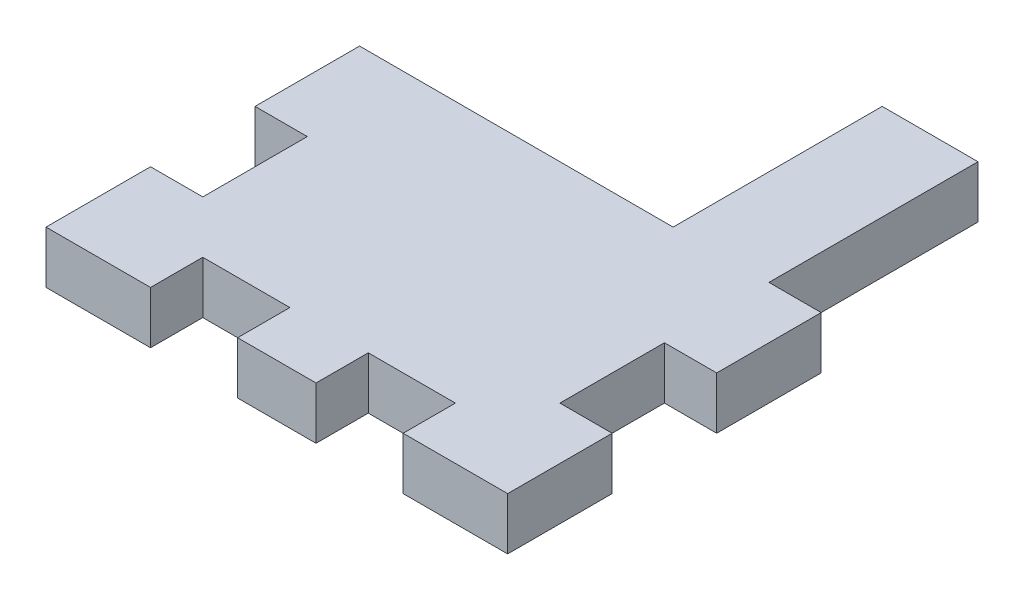
ISO-10303-21;
HEADER;
FILE_DESCRIPTION(('STEP AP214'),'2;1');
FILE_NAME('part.step','',(''),(''),'','','');
FILE_SCHEMA(('AUTOMOTIVE_DESIGN { 1 0 10303 214 1 1 1 1 }'));
ENDSEC;
DATA;
#1=APPLICATION_CONTEXT('core data for automotive mechanical design processes');
#2=APPLICATION_PROTOCOL_DEFINITION('international standard','automotive_design',2000,#1);
#3=PRODUCT_CONTEXT('',#1,'mechanical');
#4=PRODUCT('Part','Part','',(#3));
#5=PRODUCT_RELATED_PRODUCT_CATEGORY('part','',(#4));
#6=PRODUCT_DEFINITION_FORMATION('','',#4);
#7=PRODUCT_DEFINITION_CONTEXT('part definition',#1,'design');
#8=PRODUCT_DEFINITION('design','',#6,#7);
#9=PRODUCT_DEFINITION_SHAPE('','',#8);
#10=(LENGTH_UNIT() NAMED_UNIT(*) SI_UNIT(.MILLI.,.METRE.));
#11=(NAMED_UNIT(*) PLANE_ANGLE_UNIT() SI_UNIT($,.RADIAN.));
#12=(NAMED_UNIT(*) SI_UNIT($,.STERADIAN.) SOLID_ANGLE_UNIT());
#13=UNCERTAINTY_MEASURE_WITH_UNIT(LENGTH_MEASURE(1.E-05),#10,'distance_accuracy_value','');
#14=(GEOMETRIC_REPRESENTATION_CONTEXT(3) GLOBAL_UNCERTAINTY_ASSIGNED_CONTEXT((#13)) GLOBAL_UNIT_ASSIGNED_CONTEXT((#10,
#11,#12)) REPRESENTATION_CONTEXT('',''));
#15=CARTESIAN_POINT('',(0.,0.,0.));
#16=DIRECTION('',(0.,0.,1.));
#17=DIRECTION('',(1.,0.,0.));
#18=AXIS2_PLACEMENT_3D('',#15,#16,#17);
#19=CARTESIAN_POINT('',(-10.391815678133,-10.5737884773684,24.9707008080473));
#20=DIRECTION('',(0.,0.,-1.));
#21=DIRECTION('',(-1.,0.,0.));
#22=AXIS2_PLACEMENT_3D('',#19,#20,#21);
#23=PLANE('',#22);
#24=DIRECTION('',(1.,0.,0.));
#25=VECTOR('',#24,1.);
#26=CARTESIAN_POINT('',(-10.391815678133,-13.5737884773684,24.9707008080473));
#27=LINE('',#26,#25);
#28=CARTESIAN_POINT('',(-16.391815678133,-13.5737884773684,24.9707008080473));
#29=VERTEX_POINT('',#28);
#30=CARTESIAN_POINT('',(-10.391815678133,-13.5737884773684,24.9707008080473));
#31=VERTEX_POINT('',#30);
#32=EDGE_CURVE('E227',#29,#31,#27,.T.);
#33=ORIENTED_EDGE('',*,*,#32,.T.);
#34=DIRECTION('',(0.,-1.,0.));
#35=VECTOR('',#34,1.);
#36=CARTESIAN_POINT('',(-10.391815678133,-10.5737884773684,24.9707008080473));
#37=LINE('',#36,#35);
#38=CARTESIAN_POINT('',(-10.391815678133,-10.5737884773684,24.9707008080473));
#39=VERTEX_POINT('',#38);
#40=EDGE_CURVE('E42',#39,#31,#37,.T.);
#41=ORIENTED_EDGE('',*,*,#40,.F.);
#42=DIRECTION('',(1.,0.,0.));
#43=VECTOR('',#42,1.);
#44=CARTESIAN_POINT('',(-10.391815678133,-10.5737884773684,24.9707008080473));
#45=LINE('',#44,#43);
#46=CARTESIAN_POINT('',(-16.391815678133,-10.5737884773684,24.9707008080473));
#47=VERTEX_POINT('',#46);
#48=EDGE_CURVE('E273',#47,#39,#45,.T.);
#49=ORIENTED_EDGE('',*,*,#48,.F.);
#50=DIRECTION('',(0.,-1.,0.));
#51=VECTOR('',#50,1.);
#52=CARTESIAN_POINT('',(-16.391815678133,-10.5737884773684,24.9707008080473));
#53=LINE('',#52,#51);
#54=EDGE_CURVE('E223',#47,#29,#53,.T.);
#55=ORIENTED_EDGE('',*,*,#54,.T.);
#56=EDGE_LOOP('',(#33,#41,#49,#55));
#57=FACE_BOUND('',#56,.T.);
#58=ADVANCED_FACE('F35',(#57),#23,.F.);
#59=CARTESIAN_POINT('',(-10.391815678133,-10.5737884773684,21.9707008080473));
#60=DIRECTION('',(-1.,0.,0.));
#61=DIRECTION('',(0.,0.,1.));
#62=AXIS2_PLACEMENT_3D('',#59,#60,#61);
#63=PLANE('',#62);
#64=DIRECTION('',(0.,0.,-1.));
#65=VECTOR('',#64,1.);
#66=CARTESIAN_POINT('',(-10.391815678133,-13.5737884773684,21.9707008080473));
#67=LINE('',#66,#65);
#68=CARTESIAN_POINT('',(-10.391815678133,-13.5737884773684,21.9707008080473));
#69=VERTEX_POINT('',#68);
#70=EDGE_CURVE('E230',#31,#69,#67,.T.);
#71=ORIENTED_EDGE('',*,*,#70,.T.);
#72=DIRECTION('',(0.,-1.,0.));
#73=VECTOR('',#72,1.);
#74=CARTESIAN_POINT('',(-10.391815678133,-10.5737884773684,21.9707008080473));
#75=LINE('',#74,#73);
#76=CARTESIAN_POINT('',(-10.391815678133,-10.5737884773684,21.9707008080473));
#77=VERTEX_POINT('',#76);
#78=EDGE_CURVE('E325',#77,#69,#75,.T.);
#79=ORIENTED_EDGE('',*,*,#78,.F.);
#80=DIRECTION('',(0.,0.,-1.));
#81=VECTOR('',#80,1.);
#82=CARTESIAN_POINT('',(-10.391815678133,-10.5737884773684,21.9707008080473));
#83=LINE('',#82,#81);
#84=EDGE_CURVE('E141',#39,#77,#83,.T.);
#85=ORIENTED_EDGE('',*,*,#84,.F.);
#86=ORIENTED_EDGE('',*,*,#40,.T.);
#87=EDGE_LOOP('',(#71,#79,#85,#86));
#88=FACE_BOUND('',#87,.T.);
#89=ADVANCED_FACE('F328',(#88),#63,.F.);
#90=CARTESIAN_POINT('',(-5.39181567813297,-10.5737884773684,21.9707008080473));
#91=DIRECTION('',(0.,0.,-1.));
#92=DIRECTION('',(-1.,0.,0.));
#93=AXIS2_PLACEMENT_3D('',#90,#91,#92);
#94=PLANE('',#93);
#95=DIRECTION('',(1.,0.,0.));
#96=VECTOR('',#95,1.);
#97=CARTESIAN_POINT('',(-5.39181567813297,-13.5737884773684,21.9707008080473));
#98=LINE('',#97,#96);
#99=CARTESIAN_POINT('',(-5.39181567813297,-13.5737884773684,21.9707008080473));
#100=VERTEX_POINT('',#99);
#101=EDGE_CURVE('E233',#69,#100,#98,.T.);
#102=ORIENTED_EDGE('',*,*,#101,.T.);
#103=DIRECTION('',(0.,-1.,0.));
#104=VECTOR('',#103,1.);
#105=CARTESIAN_POINT('',(-5.39181567813297,-10.5737884773684,21.9707008080473));
#106=LINE('',#105,#104);
#107=CARTESIAN_POINT('',(-5.39181567813297,-10.5737884773684,21.9707008080473));
#108=VERTEX_POINT('',#107);
#109=EDGE_CURVE('E322',#108,#100,#106,.T.);
#110=ORIENTED_EDGE('',*,*,#109,.F.);
#111=DIRECTION('',(1.,0.,0.));
#112=VECTOR('',#111,1.);
#113=CARTESIAN_POINT('',(-5.39181567813297,-10.5737884773684,21.9707008080473));
#114=LINE('',#113,#112);
#115=EDGE_CURVE('E347',#77,#108,#114,.T.);
#116=ORIENTED_EDGE('',*,*,#115,.F.);
#117=ORIENTED_EDGE('',*,*,#78,.T.);
#118=EDGE_LOOP('',(#102,#110,#116,#117));
#119=FACE_BOUND('',#118,.T.);
#120=ADVANCED_FACE('F338',(#119),#94,.F.);
#121=CARTESIAN_POINT('',(-5.39181567813297,-10.5737884773684,24.9707008080473));
#122=DIRECTION('',(1.,0.,0.));
#123=DIRECTION('',(0.,0.,-1.));
#124=AXIS2_PLACEMENT_3D('',#121,#122,#123);
#125=PLANE('',#124);
#126=DIRECTION('',(0.,0.,1.));
#127=VECTOR('',#126,1.);
#128=CARTESIAN_POINT('',(-5.39181567813297,-13.5737884773684,24.9707008080473));
#129=LINE('',#128,#127);
#130=CARTESIAN_POINT('',(-5.39181567813297,-13.5737884773684,24.9707008080473));
#131=VERTEX_POINT('',#130);
#132=EDGE_CURVE('E235',#100,#131,#129,.T.);
#133=ORIENTED_EDGE('',*,*,#132,.T.);
#134=DIRECTION('',(0.,-1.,0.));
#135=VECTOR('',#134,1.);
#136=CARTESIAN_POINT('',(-5.39181567813297,-10.5737884773684,24.9707008080473));
#137=LINE('',#136,#135);
#138=CARTESIAN_POINT('',(-5.39181567813297,-10.5737884773684,24.9707008080473));
#139=VERTEX_POINT('',#138);
#140=EDGE_CURVE('E319',#139,#131,#137,.T.);
#141=ORIENTED_EDGE('',*,*,#140,.F.);
#142=DIRECTION('',(0.,0.,1.));
#143=VECTOR('',#142,1.);
#144=CARTESIAN_POINT('',(-5.39181567813297,-10.5737884773684,24.9707008080473));
#145=LINE('',#144,#143);
#146=EDGE_CURVE('E344',#108,#139,#145,.T.);
#147=ORIENTED_EDGE('',*,*,#146,.F.);
#148=ORIENTED_EDGE('',*,*,#109,.T.);
#149=EDGE_LOOP('',(#133,#141,#147,#148));
#150=FACE_BOUND('',#149,.T.);
#151=ADVANCED_FACE('F342',(#150),#125,.F.);
#152=CARTESIAN_POINT('',(-0.891815678132974,-10.5737884773684,24.9707008080473));
#153=DIRECTION('',(0.,0.,-1.));
#154=DIRECTION('',(-1.,0.,0.));
#155=AXIS2_PLACEMENT_3D('',#152,#153,#154);
#156=PLANE('',#155);
#157=DIRECTION('',(1.,0.,0.));
#158=VECTOR('',#157,1.);
#159=CARTESIAN_POINT('',(-0.891815678132974,-13.5737884773684,24.9707008080473));
#160=LINE('',#159,#158);
#161=CARTESIAN_POINT('',(-0.891815678132974,-13.5737884773684,24.9707008080473));
#162=VERTEX_POINT('',#161);
#163=EDGE_CURVE('E237',#131,#162,#160,.T.);
#164=ORIENTED_EDGE('',*,*,#163,.T.);
#165=DIRECTION('',(0.,-1.,0.));
#166=VECTOR('',#165,1.);
#167=CARTESIAN_POINT('',(-0.891815678132974,-10.5737884773684,24.9707008080473));
#168=LINE('',#167,#166);
#169=CARTESIAN_POINT('',(-0.891815678132974,-10.5737884773684,24.9707008080473));
#170=VERTEX_POINT('',#169);
#171=EDGE_CURVE('E316',#170,#162,#168,.T.);
#172=ORIENTED_EDGE('',*,*,#171,.F.);
#173=DIRECTION('',(1.,0.,0.));
#174=VECTOR('',#173,1.);
#175=CARTESIAN_POINT('',(-0.891815678132974,-10.5737884773684,24.9707008080473));
#176=LINE('',#175,#174);
#177=EDGE_CURVE('E346',#139,#170,#176,.T.);
#178=ORIENTED_EDGE('',*,*,#177,.F.);
#179=ORIENTED_EDGE('',*,*,#140,.T.);
#180=EDGE_LOOP('',(#164,#172,#178,#179));
#181=FACE_BOUND('',#180,.T.);
#182=ADVANCED_FACE('F466',(#181),#156,.F.);
#183=CARTESIAN_POINT('',(-0.891815678132974,-10.5737884773684,21.9707008080473));
#184=DIRECTION('',(-1.,0.,0.));
#185=DIRECTION('',(0.,0.,1.));
#186=AXIS2_PLACEMENT_3D('',#183,#184,#185);
#187=PLANE('',#186);
#188=DIRECTION('',(0.,0.,-1.));
#189=VECTOR('',#188,1.);
#190=CARTESIAN_POINT('',(-0.891815678132974,-13.5737884773684,21.9707008080473));
#191=LINE('',#190,#189);
#192=CARTESIAN_POINT('',(-0.891815678132974,-13.5737884773684,21.9707008080473));
#193=VERTEX_POINT('',#192);
#194=EDGE_CURVE('E239',#162,#193,#191,.T.);
#195=ORIENTED_EDGE('',*,*,#194,.T.);
#196=DIRECTION('',(0.,-1.,0.));
#197=VECTOR('',#196,1.);
#198=CARTESIAN_POINT('',(-0.891815678132974,-10.5737884773684,21.9707008080473));
#199=LINE('',#198,#197);
#200=CARTESIAN_POINT('',(-0.891815678132974,-10.5737884773684,21.9707008080473));
#201=VERTEX_POINT('',#200);
#202=EDGE_CURVE('E313',#201,#193,#199,.T.);
#203=ORIENTED_EDGE('',*,*,#202,.F.);
#204=DIRECTION('',(0.,0.,-1.));
#205=VECTOR('',#204,1.);
#206=CARTESIAN_POINT('',(-0.891815678132974,-10.5737884773684,21.9707008080473));
#207=LINE('',#206,#205);
#208=EDGE_CURVE('E349',#170,#201,#207,.T.);
#209=ORIENTED_EDGE('',*,*,#208,.F.);
#210=ORIENTED_EDGE('',*,*,#171,.T.);
#211=EDGE_LOOP('',(#195,#203,#209,#210));
#212=FACE_BOUND('',#211,.T.);
#213=ADVANCED_FACE('F462',(#212),#187,.F.);
#214=CARTESIAN_POINT('',(4.10818432186703,-10.5737884773684,21.9707008080473));
#215=DIRECTION('',(0.,0.,-1.));
#216=DIRECTION('',(-1.,0.,0.));
#217=AXIS2_PLACEMENT_3D('',#214,#215,#216);
#218=PLANE('',#217);
#219=DIRECTION('',(1.,0.,0.));
#220=VECTOR('',#219,1.);
#221=CARTESIAN_POINT('',(4.10818432186703,-13.5737884773684,21.9707008080473));
#222=LINE('',#221,#220);
#223=CARTESIAN_POINT('',(4.10818432186703,-13.5737884773684,21.9707008080473));
#224=VERTEX_POINT('',#223);
#225=EDGE_CURVE('E241',#193,#224,#222,.T.);
#226=ORIENTED_EDGE('',*,*,#225,.T.);
#227=DIRECTION('',(0.,-1.,0.));
#228=VECTOR('',#227,1.);
#229=CARTESIAN_POINT('',(4.10818432186703,-10.5737884773684,21.9707008080473));
#230=LINE('',#229,#228);
#231=CARTESIAN_POINT('',(4.10818432186703,-10.5737884773684,21.9707008080473));
#232=VERTEX_POINT('',#231);
#233=EDGE_CURVE('E310',#232,#224,#230,.T.);
#234=ORIENTED_EDGE('',*,*,#233,.F.);
#235=DIRECTION('',(1.,0.,0.));
#236=VECTOR('',#235,1.);
#237=CARTESIAN_POINT('',(4.10818432186703,-10.5737884773684,21.9707008080473));
#238=LINE('',#237,#236);
#239=EDGE_CURVE('E355',#201,#232,#238,.T.);
#240=ORIENTED_EDGE('',*,*,#239,.F.);
#241=ORIENTED_EDGE('',*,*,#202,.T.);
#242=EDGE_LOOP('',(#226,#234,#240,#241));
#243=FACE_BOUND('',#242,.T.);
#244=ADVANCED_FACE('F458',(#243),#218,.F.);
#245=CARTESIAN_POINT('',(4.10818432186703,-10.5737884773684,24.9707008080473));
#246=DIRECTION('',(1.,0.,0.));
#247=DIRECTION('',(0.,0.,-1.));
#248=AXIS2_PLACEMENT_3D('',#245,#246,#247);
#249=PLANE('',#248);
#250=DIRECTION('',(0.,0.,1.));
#251=VECTOR('',#250,1.);
#252=CARTESIAN_POINT('',(4.10818432186703,-13.5737884773684,24.9707008080473));
#253=LINE('',#252,#251);
#254=CARTESIAN_POINT('',(4.10818432186703,-13.5737884773684,24.9707008080473));
#255=VERTEX_POINT('',#254);
#256=EDGE_CURVE('E243',#224,#255,#253,.T.);
#257=ORIENTED_EDGE('',*,*,#256,.T.);
#258=DIRECTION('',(0.,-1.,0.));
#259=VECTOR('',#258,1.);
#260=CARTESIAN_POINT('',(4.10818432186703,-10.5737884773684,24.9707008080473));
#261=LINE('',#260,#259);
#262=CARTESIAN_POINT('',(4.10818432186703,-10.5737884773684,24.9707008080473));
#263=VERTEX_POINT('',#262);
#264=EDGE_CURVE('E307',#263,#255,#261,.T.);
#265=ORIENTED_EDGE('',*,*,#264,.F.);
#266=DIRECTION('',(0.,0.,1.));
#267=VECTOR('',#266,1.);
#268=CARTESIAN_POINT('',(4.10818432186703,-10.5737884773684,24.9707008080473));
#269=LINE('',#268,#267);
#270=EDGE_CURVE('E357',#232,#263,#269,.T.);
#271=ORIENTED_EDGE('',*,*,#270,.F.);
#272=ORIENTED_EDGE('',*,*,#233,.T.);
#273=EDGE_LOOP('',(#257,#265,#271,#272));
#274=FACE_BOUND('',#273,.T.);
#275=ADVANCED_FACE('F454',(#274),#249,.F.);
#276=CARTESIAN_POINT('',(10.108184321867,-10.5737884773684,24.9707008080473));
#277=DIRECTION('',(0.,0.,-1.));
#278=DIRECTION('',(-1.,0.,0.));
#279=AXIS2_PLACEMENT_3D('',#276,#277,#278);
#280=PLANE('',#279);
#281=DIRECTION('',(1.,0.,0.));
#282=VECTOR('',#281,1.);
#283=CARTESIAN_POINT('',(10.108184321867,-13.5737884773684,24.9707008080473));
#284=LINE('',#283,#282);
#285=CARTESIAN_POINT('',(10.108184321867,-13.5737884773684,24.9707008080473));
#286=VERTEX_POINT('',#285);
#287=EDGE_CURVE('E245',#255,#286,#284,.T.);
#288=ORIENTED_EDGE('',*,*,#287,.T.);
#289=DIRECTION('',(0.,-1.,0.));
#290=VECTOR('',#289,1.);
#291=CARTESIAN_POINT('',(10.108184321867,-10.5737884773684,24.9707008080473));
#292=LINE('',#291,#290);
#293=CARTESIAN_POINT('',(10.108184321867,-10.5737884773684,24.9707008080473));
#294=VERTEX_POINT('',#293);
#295=EDGE_CURVE('E304',#294,#286,#292,.T.);
#296=ORIENTED_EDGE('',*,*,#295,.F.);
#297=DIRECTION('',(1.,0.,0.));
#298=VECTOR('',#297,1.);
#299=CARTESIAN_POINT('',(10.108184321867,-10.5737884773684,24.9707008080473));
#300=LINE('',#299,#298);
#301=EDGE_CURVE('E359',#263,#294,#300,.T.);
#302=ORIENTED_EDGE('',*,*,#301,.F.);
#303=ORIENTED_EDGE('',*,*,#264,.T.);
#304=EDGE_LOOP('',(#288,#296,#302,#303));
#305=FACE_BOUND('',#304,.T.);
#306=ADVANCED_FACE('F449',(#305),#280,.F.);
#307=CARTESIAN_POINT('',(10.108184321867,-10.5737884773684,18.9707008080473));
#308=DIRECTION('',(-1.,0.,0.));
#309=DIRECTION('',(0.,0.,1.));
#310=AXIS2_PLACEMENT_3D('',#307,#308,#309);
#311=PLANE('',#310);
#312=DIRECTION('',(0.,0.,-1.));
#313=VECTOR('',#312,1.);
#314=CARTESIAN_POINT('',(10.108184321867,-13.5737884773684,18.9707008080473));
#315=LINE('',#314,#313);
#316=CARTESIAN_POINT('',(10.108184321867,-13.5737884773684,18.9707008080473));
#317=VERTEX_POINT('',#316);
#318=EDGE_CURVE('E247',#286,#317,#315,.T.);
#319=ORIENTED_EDGE('',*,*,#318,.T.);
#320=DIRECTION('',(0.,-1.,0.));
#321=VECTOR('',#320,1.);
#322=CARTESIAN_POINT('',(10.108184321867,-10.5737884773684,18.9707008080473));
#323=LINE('',#322,#321);
#324=CARTESIAN_POINT('',(10.108184321867,-10.5737884773684,18.9707008080473));
#325=VERTEX_POINT('',#324);
#326=EDGE_CURVE('E301',#325,#317,#323,.T.);
#327=ORIENTED_EDGE('',*,*,#326,.F.);
#328=DIRECTION('',(0.,0.,-1.));
#329=VECTOR('',#328,1.);
#330=CARTESIAN_POINT('',(10.108184321867,-10.5737884773684,18.9707008080473));
#331=LINE('',#330,#329);
#332=EDGE_CURVE('E361',#294,#325,#331,.T.);
#333=ORIENTED_EDGE('',*,*,#332,.F.);
#334=ORIENTED_EDGE('',*,*,#295,.T.);
#335=EDGE_LOOP('',(#319,#327,#333,#334));
#336=FACE_BOUND('',#335,.T.);
#337=ADVANCED_FACE('F443',(#336),#311,.F.);
#338=CARTESIAN_POINT('',(7.10818432186703,-10.5737884773684,18.9707008080473));
#339=DIRECTION('',(0.,0.,1.));
#340=DIRECTION('',(1.,0.,0.));
#341=AXIS2_PLACEMENT_3D('',#338,#339,#340);
#342=PLANE('',#341);
#343=DIRECTION('',(-1.,0.,0.));
#344=VECTOR('',#343,1.);
#345=CARTESIAN_POINT('',(7.10818432186703,-13.5737884773684,18.9707008080473));
#346=LINE('',#345,#344);
#347=CARTESIAN_POINT('',(7.10818432186703,-13.5737884773684,18.9707008080473));
#348=VERTEX_POINT('',#347);
#349=EDGE_CURVE('E249',#317,#348,#346,.T.);
#350=ORIENTED_EDGE('',*,*,#349,.T.);
#351=DIRECTION('',(0.,-1.,0.));
#352=VECTOR('',#351,1.);
#353=CARTESIAN_POINT('',(7.10818432186703,-10.5737884773684,18.9707008080473));
#354=LINE('',#353,#352);
#355=CARTESIAN_POINT('',(7.10818432186703,-10.5737884773684,18.9707008080473));
#356=VERTEX_POINT('',#355);
#357=EDGE_CURVE('E298',#356,#348,#354,.T.);
#358=ORIENTED_EDGE('',*,*,#357,.F.);
#359=DIRECTION('',(-1.,0.,0.));
#360=VECTOR('',#359,1.);
#361=CARTESIAN_POINT('',(7.10818432186703,-10.5737884773684,18.9707008080473));
#362=LINE('',#361,#360);
#363=EDGE_CURVE('E363',#325,#356,#362,.T.);
#364=ORIENTED_EDGE('',*,*,#363,.F.);
#365=ORIENTED_EDGE('',*,*,#326,.T.);
#366=EDGE_LOOP('',(#350,#358,#364,#365));
#367=FACE_BOUND('',#366,.T.);
#368=ADVANCED_FACE('F439',(#367),#342,.F.);
#369=CARTESIAN_POINT('',(7.10818432186703,-10.5737884773684,12.9707008080473));
#370=DIRECTION('',(-1.,0.,0.));
#371=DIRECTION('',(0.,0.,1.));
#372=AXIS2_PLACEMENT_3D('',#369,#370,#371);
#373=PLANE('',#372);
#374=DIRECTION('',(0.,0.,-1.));
#375=VECTOR('',#374,1.);
#376=CARTESIAN_POINT('',(7.10818432186703,-13.5737884773684,12.9707008080473));
#377=LINE('',#376,#375);
#378=CARTESIAN_POINT('',(7.10818432186703,-13.5737884773684,12.9707008080473));
#379=VERTEX_POINT('',#378);
#380=EDGE_CURVE('E251',#348,#379,#377,.T.);
#381=ORIENTED_EDGE('',*,*,#380,.T.);
#382=DIRECTION('',(0.,-1.,0.));
#383=VECTOR('',#382,1.);
#384=CARTESIAN_POINT('',(7.10818432186703,-10.5737884773684,12.9707008080473));
#385=LINE('',#384,#383);
#386=CARTESIAN_POINT('',(7.10818432186703,-10.5737884773684,12.9707008080473));
#387=VERTEX_POINT('',#386);
#388=EDGE_CURVE('E295',#387,#379,#385,.T.);
#389=ORIENTED_EDGE('',*,*,#388,.F.);
#390=DIRECTION('',(0.,0.,-1.));
#391=VECTOR('',#390,1.);
#392=CARTESIAN_POINT('',(7.10818432186703,-10.5737884773684,12.9707008080473));
#393=LINE('',#392,#391);
#394=EDGE_CURVE('E365',#356,#387,#393,.T.);
#395=ORIENTED_EDGE('',*,*,#394,.F.);
#396=ORIENTED_EDGE('',*,*,#357,.T.);
#397=EDGE_LOOP('',(#381,#389,#395,#396));
#398=FACE_BOUND('',#397,.T.);
#399=ADVANCED_FACE('F434',(#398),#373,.F.);
#400=CARTESIAN_POINT('',(10.108184321867,-10.5737884773684,12.9707008080473));
#401=DIRECTION('',(0.,0.,-1.));
#402=DIRECTION('',(-1.,0.,0.));
#403=AXIS2_PLACEMENT_3D('',#400,#401,#402);
#404=PLANE('',#403);
#405=DIRECTION('',(1.,0.,0.));
#406=VECTOR('',#405,1.);
#407=CARTESIAN_POINT('',(10.108184321867,-13.5737884773684,12.9707008080473));
#408=LINE('',#407,#406);
#409=CARTESIAN_POINT('',(10.108184321867,-13.5737884773684,12.9707008080473));
#410=VERTEX_POINT('',#409);
#411=EDGE_CURVE('E253',#379,#410,#408,.T.);
#412=ORIENTED_EDGE('',*,*,#411,.T.);
#413=DIRECTION('',(0.,-1.,0.));
#414=VECTOR('',#413,1.);
#415=CARTESIAN_POINT('',(10.108184321867,-10.5737884773684,12.9707008080473));
#416=LINE('',#415,#414);
#417=CARTESIAN_POINT('',(10.108184321867,-10.5737884773684,12.9707008080473));
#418=VERTEX_POINT('',#417);
#419=EDGE_CURVE('E292',#418,#410,#416,.T.);
#420=ORIENTED_EDGE('',*,*,#419,.F.);
#421=DIRECTION('',(1.,0.,0.));
#422=VECTOR('',#421,1.);
#423=CARTESIAN_POINT('',(10.108184321867,-10.5737884773684,12.9707008080473));
#424=LINE('',#423,#422);
#425=EDGE_CURVE('E367',#387,#418,#424,.T.);
#426=ORIENTED_EDGE('',*,*,#425,.F.);
#427=ORIENTED_EDGE('',*,*,#388,.T.);
#428=EDGE_LOOP('',(#412,#420,#426,#427));
#429=FACE_BOUND('',#428,.T.);
#430=ADVANCED_FACE('F428',(#429),#404,.F.);
#431=CARTESIAN_POINT('',(10.108184321867,-10.5737884773684,6.97070080804726));
#432=DIRECTION('',(-1.,0.,0.));
#433=DIRECTION('',(0.,0.,1.));
#434=AXIS2_PLACEMENT_3D('',#431,#432,#433);
#435=PLANE('',#434);
#436=DIRECTION('',(0.,0.,-1.));
#437=VECTOR('',#436,1.);
#438=CARTESIAN_POINT('',(10.108184321867,-13.5737884773684,6.97070080804726));
#439=LINE('',#438,#437);
#440=CARTESIAN_POINT('',(10.108184321867,-13.5737884773684,6.97070080804726));
#441=VERTEX_POINT('',#440);
#442=EDGE_CURVE('E255',#410,#441,#439,.T.);
#443=ORIENTED_EDGE('',*,*,#442,.T.);
#444=DIRECTION('',(0.,-1.,0.));
#445=VECTOR('',#444,1.);
#446=CARTESIAN_POINT('',(10.108184321867,-10.5737884773684,6.97070080804726));
#447=LINE('',#446,#445);
#448=CARTESIAN_POINT('',(10.108184321867,-10.5737884773684,6.97070080804726));
#449=VERTEX_POINT('',#448);
#450=EDGE_CURVE('E289',#449,#441,#447,.T.);
#451=ORIENTED_EDGE('',*,*,#450,.F.);
#452=DIRECTION('',(0.,0.,-1.));
#453=VECTOR('',#452,1.);
#454=CARTESIAN_POINT('',(10.108184321867,-10.5737884773684,6.97070080804726));
#455=LINE('',#454,#453);
#456=EDGE_CURVE('E369',#418,#449,#455,.T.);
#457=ORIENTED_EDGE('',*,*,#456,.F.);
#458=ORIENTED_EDGE('',*,*,#419,.T.);
#459=EDGE_LOOP('',(#443,#451,#457,#458));
#460=FACE_BOUND('',#459,.T.);
#461=ADVANCED_FACE('F424',(#460),#435,.F.);
#462=CARTESIAN_POINT('',(7.10818432186703,-10.5737884773684,6.97070080804726));
#463=DIRECTION('',(0.,0.,1.));
#464=DIRECTION('',(1.,0.,0.));
#465=AXIS2_PLACEMENT_3D('',#462,#463,#464);
#466=PLANE('',#465);
#467=DIRECTION('',(-1.,0.,0.));
#468=VECTOR('',#467,1.);
#469=CARTESIAN_POINT('',(7.10818432186703,-13.5737884773684,6.97070080804726));
#470=LINE('',#469,#468);
#471=CARTESIAN_POINT('',(7.10818432186703,-13.5737884773684,6.97070080804726));
#472=VERTEX_POINT('',#471);
#473=EDGE_CURVE('E257',#441,#472,#470,.T.);
#474=ORIENTED_EDGE('',*,*,#473,.T.);
#475=DIRECTION('',(0.,-1.,0.));
#476=VECTOR('',#475,1.);
#477=CARTESIAN_POINT('',(7.10818432186703,-10.5737884773684,6.97070080804726));
#478=LINE('',#477,#476);
#479=CARTESIAN_POINT('',(7.10818432186703,-10.5737884773684,6.97070080804726));
#480=VERTEX_POINT('',#479);
#481=EDGE_CURVE('E286',#480,#472,#478,.T.);
#482=ORIENTED_EDGE('',*,*,#481,.F.);
#483=DIRECTION('',(-1.,0.,0.));
#484=VECTOR('',#483,1.);
#485=CARTESIAN_POINT('',(7.10818432186703,-10.5737884773684,6.97070080804726));
#486=LINE('',#485,#484);
#487=EDGE_CURVE('E371',#449,#480,#486,.T.);
#488=ORIENTED_EDGE('',*,*,#487,.F.);
#489=ORIENTED_EDGE('',*,*,#450,.T.);
#490=EDGE_LOOP('',(#474,#482,#488,#489));
#491=FACE_BOUND('',#490,.T.);
#492=ADVANCED_FACE('F420',(#491),#466,.F.);
#493=CARTESIAN_POINT('',(7.10818432186703,-10.5737884773684,-5.02929919195273));
#494=DIRECTION('',(-1.,0.,0.));
#495=DIRECTION('',(0.,0.,1.));
#496=AXIS2_PLACEMENT_3D('',#493,#494,#495);
#497=PLANE('',#496);
#498=DIRECTION('',(0.,0.,-1.));
#499=VECTOR('',#498,1.);
#500=CARTESIAN_POINT('',(7.10818432186703,-13.5737884773684,-5.02929919195273));
#501=LINE('',#500,#499);
#502=CARTESIAN_POINT('',(7.10818432186703,-13.5737884773684,-5.02929919195273));
#503=VERTEX_POINT('',#502);
#504=EDGE_CURVE('E259',#472,#503,#501,.T.);
#505=ORIENTED_EDGE('',*,*,#504,.T.);
#506=DIRECTION('',(0.,-1.,0.));
#507=VECTOR('',#506,1.);
#508=CARTESIAN_POINT('',(7.10818432186703,-10.5737884773684,-5.02929919195273));
#509=LINE('',#508,#507);
#510=CARTESIAN_POINT('',(7.10818432186703,-10.5737884773684,-5.02929919195273));
#511=VERTEX_POINT('',#510);
#512=EDGE_CURVE('E283',#511,#503,#509,.T.);
#513=ORIENTED_EDGE('',*,*,#512,.F.);
#514=DIRECTION('',(0.,0.,-1.));
#515=VECTOR('',#514,1.);
#516=CARTESIAN_POINT('',(7.10818432186703,-10.5737884773684,-5.02929919195273));
#517=LINE('',#516,#515);
#518=EDGE_CURVE('E373',#480,#511,#517,.T.);
#519=ORIENTED_EDGE('',*,*,#518,.F.);
#520=ORIENTED_EDGE('',*,*,#481,.T.);
#521=EDGE_LOOP('',(#505,#513,#519,#520));
#522=FACE_BOUND('',#521,.T.);
#523=ADVANCED_FACE('F414',(#522),#497,.F.);
#524=CARTESIAN_POINT('',(-13.391815678133,-10.5737884773684,-5.02929919195273));
#525=DIRECTION('',(0.,0.,1.));
#526=DIRECTION('',(1.,0.,0.));
#527=AXIS2_PLACEMENT_3D('',#524,#525,#526);
#528=PLANE('',#527);
#529=DIRECTION('',(-1.,0.,0.));
#530=VECTOR('',#529,1.);
#531=CARTESIAN_POINT('',(-13.391815678133,-13.5737884773684,-5.02929919195273));
#532=LINE('',#531,#530);
#533=CARTESIAN_POINT('',(1.60818432186703,-13.5737884773684,-5.02929919195273));
#534=VERTEX_POINT('',#533);
#535=EDGE_CURVE('E261',#503,#534,#532,.T.);
#536=ORIENTED_EDGE('',*,*,#535,.T.);
#537=DIRECTION('',(0.,1.,0.));
#538=VECTOR('',#537,1.);
#539=CARTESIAN_POINT('',(1.60818432186703,-20.5737884773684,-5.02929919195273));
#540=LINE('',#539,#538);
#541=CARTESIAN_POINT('',(1.60818432186703,-10.5737884773684,-5.02929919195273));
#542=VERTEX_POINT('',#541);
#543=EDGE_CURVE('E231',#534,#542,#540,.T.);
#544=ORIENTED_EDGE('',*,*,#543,.T.);
#545=DIRECTION('',(-1.,0.,0.));
#546=VECTOR('',#545,1.);
#547=CARTESIAN_POINT('',(-13.391815678133,-10.5737884773684,-5.02929919195273));
#548=LINE('',#547,#546);
#549=EDGE_CURVE('E375',#511,#542,#548,.T.);
#550=ORIENTED_EDGE('',*,*,#549,.F.);
#551=ORIENTED_EDGE('',*,*,#512,.T.);
#552=EDGE_LOOP('',(#536,#544,#550,#551));
#553=FACE_BOUND('',#552,.T.);
#554=ADVANCED_FACE('F407',(#553),#528,.F.);
#555=CARTESIAN_POINT('',(-16.391815678133,-10.5737884773684,6.97070080804726));
#556=DIRECTION('',(0.,0.,1.));
#557=DIRECTION('',(1.,0.,0.));
#558=AXIS2_PLACEMENT_3D('',#555,#556,#557);
#559=PLANE('',#558);
#560=DIRECTION('',(-1.,0.,0.));
#561=VECTOR('',#560,1.);
#562=CARTESIAN_POINT('',(-16.391815678133,-13.5737884773684,6.97070080804726));
#563=LINE('',#562,#561);
#564=CARTESIAN_POINT('',(1.60818432186703,-13.5737884773684,6.97070080804726));
#565=VERTEX_POINT('',#564);
#566=CARTESIAN_POINT('',(-16.391815678133,-13.5737884773684,6.97070080804726));
#567=VERTEX_POINT('',#566);
#568=EDGE_CURVE('E49',#565,#567,#563,.T.);
#569=ORIENTED_EDGE('',*,*,#568,.T.);
#570=DIRECTION('',(0.,-1.,0.));
#571=VECTOR('',#570,1.);
#572=CARTESIAN_POINT('',(-16.391815678133,-10.5737884773684,6.97070080804726));
#573=LINE('',#572,#571);
#574=CARTESIAN_POINT('',(-16.391815678133,-10.5737884773684,6.97070080804726));
#575=VERTEX_POINT('',#574);
#576=EDGE_CURVE('E280',#575,#567,#573,.T.);
#577=ORIENTED_EDGE('',*,*,#576,.F.);
#578=DIRECTION('',(-1.,0.,0.));
#579=VECTOR('',#578,1.);
#580=CARTESIAN_POINT('',(-16.391815678133,-10.5737884773684,6.97070080804726));
#581=LINE('',#580,#579);
#582=CARTESIAN_POINT('',(1.60818432186703,-10.5737884773684,6.97070080804726));
#583=VERTEX_POINT('',#582);
#584=EDGE_CURVE('E377',#583,#575,#581,.T.);
#585=ORIENTED_EDGE('',*,*,#584,.F.);
#586=DIRECTION('',(0.,1.,0.));
#587=VECTOR('',#586,1.);
#588=CARTESIAN_POINT('',(1.60818432186703,-20.5737884773684,6.97070080804726));
#589=LINE('',#588,#587);
#590=EDGE_CURVE('E393',#565,#583,#589,.T.);
#591=ORIENTED_EDGE('',*,*,#590,.F.);
#592=EDGE_LOOP('',(#569,#577,#585,#591));
#593=FACE_BOUND('',#592,.T.);
#594=ADVANCED_FACE('F590',(#593),#559,.F.);
#595=CARTESIAN_POINT('',(-16.391815678133,-10.5737884773684,12.9707008080473));
#596=DIRECTION('',(1.,0.,0.));
#597=DIRECTION('',(0.,0.,-1.));
#598=AXIS2_PLACEMENT_3D('',#595,#596,#597);
#599=PLANE('',#598);
#600=DIRECTION('',(0.,0.,1.));
#601=VECTOR('',#600,1.);
#602=CARTESIAN_POINT('',(-16.391815678133,-13.5737884773684,12.9707008080473));
#603=LINE('',#602,#601);
#604=CARTESIAN_POINT('',(-16.391815678133,-13.5737884773684,12.9707008080473));
#605=VERTEX_POINT('',#604);
#606=EDGE_CURVE('E265',#567,#605,#603,.T.);
#607=ORIENTED_EDGE('',*,*,#606,.T.);
#608=DIRECTION('',(0.,-1.,0.));
#609=VECTOR('',#608,1.);
#610=CARTESIAN_POINT('',(-16.391815678133,-10.5737884773684,12.9707008080473));
#611=LINE('',#610,#609);
#612=CARTESIAN_POINT('',(-16.391815678133,-10.5737884773684,12.9707008080473));
#613=VERTEX_POINT('',#612);
#614=EDGE_CURVE('E277',#613,#605,#611,.T.);
#615=ORIENTED_EDGE('',*,*,#614,.F.);
#616=DIRECTION('',(0.,0.,1.));
#617=VECTOR('',#616,1.);
#618=CARTESIAN_POINT('',(-16.391815678133,-10.5737884773684,12.9707008080473));
#619=LINE('',#618,#617);
#620=EDGE_CURVE('E379',#575,#613,#619,.T.);
#621=ORIENTED_EDGE('',*,*,#620,.F.);
#622=ORIENTED_EDGE('',*,*,#576,.T.);
#623=EDGE_LOOP('',(#607,#615,#621,#622));
#624=FACE_BOUND('',#623,.T.);
#625=ADVANCED_FACE('F386',(#624),#599,.F.);
#626=CARTESIAN_POINT('',(-13.391815678133,-10.5737884773684,12.9707008080473));
#627=DIRECTION('',(0.,0.,-1.));
#628=DIRECTION('',(-1.,0.,0.));
#629=AXIS2_PLACEMENT_3D('',#626,#627,#628);
#630=PLANE('',#629);
#631=DIRECTION('',(1.,0.,0.));
#632=VECTOR('',#631,1.);
#633=CARTESIAN_POINT('',(-13.391815678133,-13.5737884773684,12.9707008080473));
#634=LINE('',#633,#632);
#635=CARTESIAN_POINT('',(-13.391815678133,-13.5737884773684,12.9707008080473));
#636=VERTEX_POINT('',#635);
#637=EDGE_CURVE('E267',#605,#636,#634,.T.);
#638=ORIENTED_EDGE('',*,*,#637,.T.);
#639=DIRECTION('',(0.,-1.,0.));
#640=VECTOR('',#639,1.);
#641=CARTESIAN_POINT('',(-13.391815678133,-10.5737884773684,12.9707008080473));
#642=LINE('',#641,#640);
#643=CARTESIAN_POINT('',(-13.391815678133,-10.5737884773684,12.9707008080473));
#644=VERTEX_POINT('',#643);
#645=EDGE_CURVE('E218',#644,#636,#642,.T.);
#646=ORIENTED_EDGE('',*,*,#645,.F.);
#647=DIRECTION('',(1.,0.,0.));
#648=VECTOR('',#647,1.);
#649=CARTESIAN_POINT('',(-13.391815678133,-10.5737884773684,12.9707008080473));
#650=LINE('',#649,#648);
#651=EDGE_CURVE('E206',#613,#644,#650,.T.);
#652=ORIENTED_EDGE('',*,*,#651,.F.);
#653=ORIENTED_EDGE('',*,*,#614,.T.);
#654=EDGE_LOOP('',(#638,#646,#652,#653));
#655=FACE_BOUND('',#654,.T.);
#656=ADVANCED_FACE('F389',(#655),#630,.F.);
#657=CARTESIAN_POINT('',(-13.391815678133,-10.5737884773684,18.9707008080473));
#658=DIRECTION('',(1.,0.,0.));
#659=DIRECTION('',(0.,0.,-1.));
#660=AXIS2_PLACEMENT_3D('',#657,#658,#659);
#661=PLANE('',#660);
#662=DIRECTION('',(0.,0.,1.));
#663=VECTOR('',#662,1.);
#664=CARTESIAN_POINT('',(-13.391815678133,-13.5737884773684,18.9707008080473));
#665=LINE('',#664,#663);
#666=CARTESIAN_POINT('',(-13.391815678133,-13.5737884773684,18.9707008080473));
#667=VERTEX_POINT('',#666);
#668=EDGE_CURVE('E215',#636,#667,#665,.T.);
#669=ORIENTED_EDGE('',*,*,#668,.T.);
#670=DIRECTION('',(0.,-1.,0.));
#671=VECTOR('',#670,1.);
#672=CARTESIAN_POINT('',(-13.391815678133,-10.5737884773684,18.9707008080473));
#673=LINE('',#672,#671);
#674=CARTESIAN_POINT('',(-13.391815678133,-10.5737884773684,18.9707008080473));
#675=VERTEX_POINT('',#674);
#676=EDGE_CURVE('E212',#675,#667,#673,.T.);
#677=ORIENTED_EDGE('',*,*,#676,.F.);
#678=DIRECTION('',(0.,0.,1.));
#679=VECTOR('',#678,1.);
#680=CARTESIAN_POINT('',(-13.391815678133,-10.5737884773684,18.9707008080473));
#681=LINE('',#680,#679);
#682=EDGE_CURVE('E198',#644,#675,#681,.T.);
#683=ORIENTED_EDGE('',*,*,#682,.F.);
#684=ORIENTED_EDGE('',*,*,#645,.T.);
#685=EDGE_LOOP('',(#669,#677,#683,#684));
#686=FACE_BOUND('',#685,.T.);
#687=ADVANCED_FACE('F213',(#686),#661,.F.);
#688=CARTESIAN_POINT('',(-16.391815678133,-10.5737884773684,18.9707008080473));
#689=DIRECTION('',(0.,0.,1.));
#690=DIRECTION('',(1.,0.,0.));
#691=AXIS2_PLACEMENT_3D('',#688,#689,#690);
#692=PLANE('',#691);
#693=DIRECTION('',(-1.,0.,0.));
#694=VECTOR('',#693,1.);
#695=CARTESIAN_POINT('',(-16.391815678133,-13.5737884773684,18.9707008080473));
#696=LINE('',#695,#694);
#697=CARTESIAN_POINT('',(-16.391815678133,-13.5737884773684,18.9707008080473));
#698=VERTEX_POINT('',#697);
#699=EDGE_CURVE('E270',#667,#698,#696,.T.);
#700=ORIENTED_EDGE('',*,*,#699,.T.);
#701=DIRECTION('',(0.,-1.,0.));
#702=VECTOR('',#701,1.);
#703=CARTESIAN_POINT('',(-16.391815678133,-10.5737884773684,18.9707008080473));
#704=LINE('',#703,#702);
#705=CARTESIAN_POINT('',(-16.391815678133,-10.5737884773684,18.9707008080473));
#706=VERTEX_POINT('',#705);
#707=EDGE_CURVE('E219',#706,#698,#704,.T.);
#708=ORIENTED_EDGE('',*,*,#707,.F.);
#709=DIRECTION('',(-1.,0.,0.));
#710=VECTOR('',#709,1.);
#711=CARTESIAN_POINT('',(-16.391815678133,-10.5737884773684,18.9707008080473));
#712=LINE('',#711,#710);
#713=EDGE_CURVE('E203',#675,#706,#712,.T.);
#714=ORIENTED_EDGE('',*,*,#713,.F.);
#715=ORIENTED_EDGE('',*,*,#676,.T.);
#716=EDGE_LOOP('',(#700,#708,#714,#715));
#717=FACE_BOUND('',#716,.T.);
#718=ADVANCED_FACE('F221',(#717),#692,.F.);
#719=CARTESIAN_POINT('',(-16.391815678133,-10.5737884773684,24.9707008080473));
#720=DIRECTION('',(1.,0.,0.));
#721=DIRECTION('',(0.,0.,-1.));
#722=AXIS2_PLACEMENT_3D('',#719,#720,#721);
#723=PLANE('',#722);
#724=DIRECTION('',(0.,0.,1.));
#725=VECTOR('',#724,1.);
#726=CARTESIAN_POINT('',(-16.391815678133,-13.5737884773684,24.9707008080473));
#727=LINE('',#726,#725);
#728=EDGE_CURVE('E132',#698,#29,#727,.T.);
#729=ORIENTED_EDGE('',*,*,#728,.T.);
#730=ORIENTED_EDGE('',*,*,#54,.F.);
#731=DIRECTION('',(0.,0.,1.));
#732=VECTOR('',#731,1.);
#733=CARTESIAN_POINT('',(-16.391815678133,-10.5737884773684,24.9707008080473));
#734=LINE('',#733,#732);
#735=EDGE_CURVE('E58',#706,#47,#734,.T.);
#736=ORIENTED_EDGE('',*,*,#735,.F.);
#737=ORIENTED_EDGE('',*,*,#707,.T.);
#738=EDGE_LOOP('',(#729,#730,#736,#737));
#739=FACE_BOUND('',#738,.T.);
#740=ADVANCED_FACE('F390',(#739),#723,.F.);
#741=CARTESIAN_POINT('',(-16.391815678133,-10.5737884773684,24.9707008080473));
#742=DIRECTION('',(0.,-1.,0.));
#743=DIRECTION('',(0.,0.,-1.));
#744=AXIS2_PLACEMENT_3D('',#741,#742,#743);
#745=PLANE('',#744);
#746=ORIENTED_EDGE('',*,*,#549,.T.);
#747=DIRECTION('',(0.,0.,-1.));
#748=VECTOR('',#747,1.);
#749=CARTESIAN_POINT('',(1.60818432186703,-10.5737884773684,6.97070080804726));
#750=LINE('',#749,#748);
#751=EDGE_CURVE('E396',#583,#542,#750,.T.);
#752=ORIENTED_EDGE('',*,*,#751,.F.);
#753=ORIENTED_EDGE('',*,*,#584,.T.);
#754=ORIENTED_EDGE('',*,*,#620,.T.);
#755=ORIENTED_EDGE('',*,*,#651,.T.);
#756=ORIENTED_EDGE('',*,*,#682,.T.);
#757=ORIENTED_EDGE('',*,*,#713,.T.);
#758=ORIENTED_EDGE('',*,*,#735,.T.);
#759=ORIENTED_EDGE('',*,*,#48,.T.);
#760=ORIENTED_EDGE('',*,*,#84,.T.);
#761=ORIENTED_EDGE('',*,*,#115,.T.);
#762=ORIENTED_EDGE('',*,*,#146,.T.);
#763=ORIENTED_EDGE('',*,*,#177,.T.);
#764=ORIENTED_EDGE('',*,*,#208,.T.);
#765=ORIENTED_EDGE('',*,*,#239,.T.);
#766=ORIENTED_EDGE('',*,*,#270,.T.);
#767=ORIENTED_EDGE('',*,*,#301,.T.);
#768=ORIENTED_EDGE('',*,*,#332,.T.);
#769=ORIENTED_EDGE('',*,*,#363,.T.);
#770=ORIENTED_EDGE('',*,*,#394,.T.);
#771=ORIENTED_EDGE('',*,*,#425,.T.);
#772=ORIENTED_EDGE('',*,*,#456,.T.);
#773=ORIENTED_EDGE('',*,*,#487,.T.);
#774=ORIENTED_EDGE('',*,*,#518,.T.);
#775=EDGE_LOOP('',(#746,#752,#753,#754,#755,#756,#757,#758,#759,#760,#761,#762,#763,#764,#765,
#766,#767,#768,#769,#770,#771,#772,#773,#774));
#776=FACE_BOUND('',#775,.T.);
#777=ADVANCED_FACE('F201',(#776),#745,.F.);
#778=CARTESIAN_POINT('',(-16.391815678133,-13.5737884773684,24.9707008080473));
#779=DIRECTION('',(0.,-1.,0.));
#780=DIRECTION('',(0.,0.,-1.));
#781=AXIS2_PLACEMENT_3D('',#778,#779,#780);
#782=PLANE('',#781);
#783=DIRECTION('',(0.,0.,1.));
#784=VECTOR('',#783,1.);
#785=CARTESIAN_POINT('',(1.60818432186703,-13.5737884773684,24.9707008080473));
#786=LINE('',#785,#784);
#787=EDGE_CURVE('E11',#534,#565,#786,.T.);
#788=ORIENTED_EDGE('',*,*,#787,.F.);
#789=ORIENTED_EDGE('',*,*,#535,.F.);
#790=ORIENTED_EDGE('',*,*,#504,.F.);
#791=ORIENTED_EDGE('',*,*,#473,.F.);
#792=ORIENTED_EDGE('',*,*,#442,.F.);
#793=ORIENTED_EDGE('',*,*,#411,.F.);
#794=ORIENTED_EDGE('',*,*,#380,.F.);
#795=ORIENTED_EDGE('',*,*,#349,.F.);
#796=ORIENTED_EDGE('',*,*,#318,.F.);
#797=ORIENTED_EDGE('',*,*,#287,.F.);
#798=ORIENTED_EDGE('',*,*,#256,.F.);
#799=ORIENTED_EDGE('',*,*,#225,.F.);
#800=ORIENTED_EDGE('',*,*,#194,.F.);
#801=ORIENTED_EDGE('',*,*,#163,.F.);
#802=ORIENTED_EDGE('',*,*,#132,.F.);
#803=ORIENTED_EDGE('',*,*,#101,.F.);
#804=ORIENTED_EDGE('',*,*,#70,.F.);
#805=ORIENTED_EDGE('',*,*,#32,.F.);
#806=ORIENTED_EDGE('',*,*,#728,.F.);
#807=ORIENTED_EDGE('',*,*,#699,.F.);
#808=ORIENTED_EDGE('',*,*,#668,.F.);
#809=ORIENTED_EDGE('',*,*,#637,.F.);
#810=ORIENTED_EDGE('',*,*,#606,.F.);
#811=ORIENTED_EDGE('',*,*,#568,.F.);
#812=EDGE_LOOP('',(#788,#789,#790,#791,#792,#793,#794,#795,#796,#797,#798,#799,#800,#801,#802,
#803,#804,#805,#806,#807,#808,#809,#810,#811));
#813=FACE_BOUND('',#812,.T.);
#814=ADVANCED_FACE('F332',(#813),#782,.T.);
#815=CARTESIAN_POINT('',(1.60818432186703,-20.5737884773684,6.97070080804726));
#816=DIRECTION('',(1.,0.,0.));
#817=DIRECTION('',(0.,0.,-1.));
#818=AXIS2_PLACEMENT_3D('',#815,#816,#817);
#819=PLANE('',#818);
#820=ORIENTED_EDGE('',*,*,#787,.T.);
#821=ORIENTED_EDGE('',*,*,#590,.T.);
#822=ORIENTED_EDGE('',*,*,#751,.T.);
#823=ORIENTED_EDGE('',*,*,#543,.F.);
#824=EDGE_LOOP('',(#820,#821,#822,#823));
#825=FACE_BOUND('',#824,.T.);
#826=ADVANCED_FACE('F403',(#825),#819,.F.);
#827=CLOSED_SHELL('',(#58,#89,#120,#151,#182,#213,#244,#275,#306,#337,#368,#399,#430,#461,#492,
#523,#554,#594,#625,#656,#687,#718,#740,#777,#814,#826));
#828=MANIFOLD_SOLID_BREP('B2',#827);
#829=ADVANCED_BREP_SHAPE_REPRESENTATION('',(#18,#828),#14);
#830=SHAPE_DEFINITION_REPRESENTATION(#9,#829);
ENDSEC;
END-ISO-10303-21;
